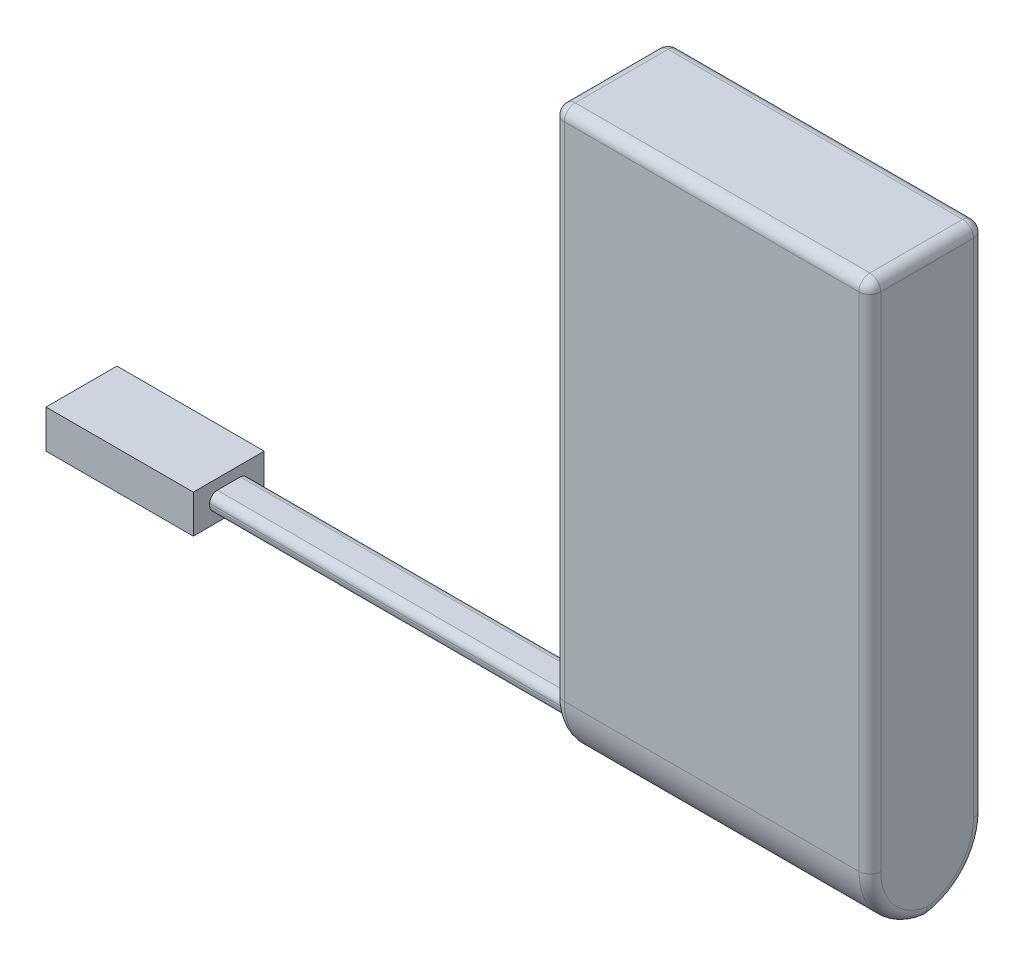
ISO-10303-21;
HEADER;
FILE_DESCRIPTION(('STEP AP214'),'2;1');
FILE_NAME('part.step','',(''),(''),'','','');
FILE_SCHEMA(('AUTOMOTIVE_DESIGN { 1 0 10303 214 1 1 1 1 }'));
ENDSEC;
DATA;
#1=APPLICATION_CONTEXT('core data for automotive mechanical design processes');
#2=APPLICATION_PROTOCOL_DEFINITION('international standard','automotive_design',2000,#1);
#3=PRODUCT_CONTEXT('',#1,'mechanical');
#4=PRODUCT('Part','Part','',(#3));
#5=PRODUCT_RELATED_PRODUCT_CATEGORY('part','',(#4));
#6=PRODUCT_DEFINITION_FORMATION('','',#4);
#7=PRODUCT_DEFINITION_CONTEXT('part definition',#1,'design');
#8=PRODUCT_DEFINITION('design','',#6,#7);
#9=PRODUCT_DEFINITION_SHAPE('','',#8);
#10=(LENGTH_UNIT() NAMED_UNIT(*) SI_UNIT(.MILLI.,.METRE.));
#11=(NAMED_UNIT(*) PLANE_ANGLE_UNIT() SI_UNIT($,.RADIAN.));
#12=(NAMED_UNIT(*) SI_UNIT($,.STERADIAN.) SOLID_ANGLE_UNIT());
#13=UNCERTAINTY_MEASURE_WITH_UNIT(LENGTH_MEASURE(1.E-05),#10,'distance_accuracy_value','');
#14=(GEOMETRIC_REPRESENTATION_CONTEXT(3) GLOBAL_UNCERTAINTY_ASSIGNED_CONTEXT((#13)) GLOBAL_UNIT_ASSIGNED_CONTEXT((#10,
#11,#12)) REPRESENTATION_CONTEXT('',''));
#15=CARTESIAN_POINT('',(0.,0.,0.));
#16=DIRECTION('',(0.,0.,1.));
#17=DIRECTION('',(1.,0.,0.));
#18=AXIS2_PLACEMENT_3D('',#15,#16,#17);
#19=CARTESIAN_POINT('',(-14.5,-26.5,10.5));
#20=DIRECTION('',(1.,0.,0.));
#21=DIRECTION('',(0.,0.,-1.));
#22=AXIS2_PLACEMENT_3D('',#19,#20,#21);
#23=PLANE('',#22);
#24=CARTESIAN_POINT('',(-14.5,-24.7434299833213,4.2));
#25=DIRECTION('',(-1.,0.,0.));
#26=DIRECTION('',(0.,0.,1.));
#27=AXIS2_PLACEMENT_3D('',#24,#25,#26);
#28=CIRCLE('',#27,0.699999999999999);
#29=CARTESIAN_POINT('',(-14.5,-24.7434299833213,3.5));
#30=VERTEX_POINT('',#29);
#31=CARTESIAN_POINT('',(-14.5,-24.8334798520684,3.50581629150589));
#32=VERTEX_POINT('',#31);
#33=EDGE_CURVE('E248',#30,#32,#28,.T.);
#34=ORIENTED_EDGE('',*,*,#33,.F.);
#35=DIRECTION('',(0.,-1.,0.));
#36=VECTOR('',#35,1.);
#37=CARTESIAN_POINT('',(-14.5,-24.5434299833213,3.5));
#38=LINE('',#37,#36);
#39=CARTESIAN_POINT('',(-14.5,-24.5434299833213,3.5));
#40=VERTEX_POINT('',#39);
#41=EDGE_CURVE('E258',#40,#30,#38,.T.);
#42=ORIENTED_EDGE('',*,*,#41,.F.);
#43=CARTESIAN_POINT('',(-14.5,-24.5434299833213,4.2));
#44=DIRECTION('',(-1.,0.,0.));
#45=DIRECTION('',(0.,0.,1.));
#46=AXIS2_PLACEMENT_3D('',#43,#44,#45);
#47=CIRCLE('',#46,0.699999999999999);
#48=CARTESIAN_POINT('',(-14.5,-23.8434299833213,4.2));
#49=VERTEX_POINT('',#48);
#50=EDGE_CURVE('E294',#49,#40,#47,.T.);
#51=ORIENTED_EDGE('',*,*,#50,.F.);
#52=DIRECTION('',(0.,0.,-1.));
#53=VECTOR('',#52,1.);
#54=CARTESIAN_POINT('',(-14.5,-23.8434299833213,6.29999999999999));
#55=LINE('',#54,#53);
#56=CARTESIAN_POINT('',(-14.5,-23.8434299833213,6.29999999999999));
#57=VERTEX_POINT('',#56);
#58=EDGE_CURVE('E291',#57,#49,#55,.T.);
#59=ORIENTED_EDGE('',*,*,#58,.F.);
#60=CARTESIAN_POINT('',(-14.5,-24.5434299833213,6.3));
#61=DIRECTION('',(-1.,0.,0.));
#62=DIRECTION('',(0.,0.,1.));
#63=AXIS2_PLACEMENT_3D('',#60,#61,#62);
#64=CIRCLE('',#63,0.7);
#65=CARTESIAN_POINT('',(-14.5,-24.5434299833213,7.));
#66=VERTEX_POINT('',#65);
#67=EDGE_CURVE('E76',#66,#57,#64,.T.);
#68=ORIENTED_EDGE('',*,*,#67,.F.);
#69=DIRECTION('',(0.,1.,0.));
#70=VECTOR('',#69,1.);
#71=CARTESIAN_POINT('',(-14.5,-24.5434299833213,7.));
#72=LINE('',#71,#70);
#73=CARTESIAN_POINT('',(-14.5,-24.7434299833213,7.));
#74=VERTEX_POINT('',#73);
#75=EDGE_CURVE('E71',#74,#66,#72,.T.);
#76=ORIENTED_EDGE('',*,*,#75,.F.);
#77=CARTESIAN_POINT('',(-14.5,-24.7434299833213,6.3));
#78=DIRECTION('',(-1.,0.,0.));
#79=DIRECTION('',(0.,0.,-1.));
#80=AXIS2_PLACEMENT_3D('',#77,#78,#79);
#81=CIRCLE('',#80,0.7);
#82=CARTESIAN_POINT('',(-14.5,-24.8334798520684,6.99418370849411));
#83=VERTEX_POINT('',#82);
#84=EDGE_CURVE('E285',#83,#74,#81,.T.);
#85=ORIENTED_EDGE('',*,*,#84,.F.);
#86=CARTESIAN_POINT('',(-14.5,-20.5,4.5));
#87=DIRECTION('',(1.,0.,0.));
#88=DIRECTION('',(0.,0.,-1.));
#89=AXIS2_PLACEMENT_3D('',#86,#87,#88);
#90=CIRCLE('',#89,5.);
#91=CARTESIAN_POINT('',(-14.5,-20.5,9.5));
#92=VERTEX_POINT('',#91);
#93=EDGE_CURVE('E338',#83,#92,#90,.F.);
#94=ORIENTED_EDGE('',*,*,#93,.T.);
#95=DIRECTION('',(0.,-1.,0.));
#96=VECTOR('',#95,1.);
#97=CARTESIAN_POINT('',(-14.5,26.5,9.5));
#98=LINE('',#97,#96);
#99=CARTESIAN_POINT('',(-14.5,25.5,9.5));
#100=VERTEX_POINT('',#99);
#101=EDGE_CURVE('E334',#92,#100,#98,.F.);
#102=ORIENTED_EDGE('',*,*,#101,.T.);
#103=DIRECTION('',(0.,0.,-1.));
#104=VECTOR('',#103,1.);
#105=CARTESIAN_POINT('',(-14.5,25.5,10.5));
#106=LINE('',#105,#104);
#107=CARTESIAN_POINT('',(-14.5,25.5,0.999999999999999));
#108=VERTEX_POINT('',#107);
#109=EDGE_CURVE('E330',#100,#108,#106,.T.);
#110=ORIENTED_EDGE('',*,*,#109,.T.);
#111=DIRECTION('',(0.,-1.,0.));
#112=VECTOR('',#111,1.);
#113=CARTESIAN_POINT('',(-14.5,-26.5,0.999999999999999));
#114=LINE('',#113,#112);
#115=CARTESIAN_POINT('',(-14.5,-20.5,0.999999999999999));
#116=VERTEX_POINT('',#115);
#117=EDGE_CURVE('E336',#108,#116,#114,.T.);
#118=ORIENTED_EDGE('',*,*,#117,.T.);
#119=CARTESIAN_POINT('',(-14.5,-20.5,6.));
#120=DIRECTION('',(1.,0.,0.));
#121=DIRECTION('',(0.,0.,-1.));
#122=AXIS2_PLACEMENT_3D('',#119,#120,#121);
#123=CIRCLE('',#122,5.);
#124=EDGE_CURVE('E343',#116,#32,#123,.F.);
#125=ORIENTED_EDGE('',*,*,#124,.T.);
#126=EDGE_LOOP('',(#34,#42,#51,#59,#68,#76,#85,#94,#102,#110,#118,#125));
#127=FACE_BOUND('',#126,.T.);
#128=ADVANCED_FACE('F49',(#127),#23,.F.);
#129=CARTESIAN_POINT('',(-14.5,26.5,10.5));
#130=DIRECTION('',(0.,-1.,0.));
#131=DIRECTION('',(1.,0.,0.));
#132=AXIS2_PLACEMENT_3D('',#129,#130,#131);
#133=PLANE('',#132);
#134=DIRECTION('',(-1.,0.,0.));
#135=VECTOR('',#134,1.);
#136=CARTESIAN_POINT('',(-14.5,26.5,0.999999999999999));
#137=LINE('',#136,#135);
#138=CARTESIAN_POINT('',(13.5,26.5,0.999999999999999));
#139=VERTEX_POINT('',#138);
#140=CARTESIAN_POINT('',(-13.5,26.5,0.999999999999999));
#141=VERTEX_POINT('',#140);
#142=EDGE_CURVE('E63',#139,#141,#137,.T.);
#143=ORIENTED_EDGE('',*,*,#142,.T.);
#144=DIRECTION('',(0.,0.,-1.));
#145=VECTOR('',#144,1.);
#146=CARTESIAN_POINT('',(-13.5,26.5,10.5));
#147=LINE('',#146,#145);
#148=CARTESIAN_POINT('',(-13.5,26.5,9.5));
#149=VERTEX_POINT('',#148);
#150=EDGE_CURVE('E11',#141,#149,#147,.F.);
#151=ORIENTED_EDGE('',*,*,#150,.T.);
#152=DIRECTION('',(-1.,0.,0.));
#153=VECTOR('',#152,1.);
#154=CARTESIAN_POINT('',(14.5,26.5,9.5));
#155=LINE('',#154,#153);
#156=CARTESIAN_POINT('',(13.5,26.5,9.5));
#157=VERTEX_POINT('',#156);
#158=EDGE_CURVE('E380',#149,#157,#155,.F.);
#159=ORIENTED_EDGE('',*,*,#158,.T.);
#160=DIRECTION('',(0.,0.,-1.));
#161=VECTOR('',#160,1.);
#162=CARTESIAN_POINT('',(13.5,26.5,10.5));
#163=LINE('',#162,#161);
#164=EDGE_CURVE('E378',#157,#139,#163,.T.);
#165=ORIENTED_EDGE('',*,*,#164,.T.);
#166=EDGE_LOOP('',(#143,#151,#159,#165));
#167=FACE_BOUND('',#166,.T.);
#168=ADVANCED_FACE('F463',(#167),#133,.F.);
#169=CARTESIAN_POINT('',(14.5,-26.5,10.5));
#170=DIRECTION('',(-1.,0.,0.));
#171=DIRECTION('',(0.,0.,1.));
#172=AXIS2_PLACEMENT_3D('',#169,#170,#171);
#173=PLANE('',#172);
#174=CARTESIAN_POINT('',(14.5,-20.5,6.));
#175=DIRECTION('',(-1.,0.,0.));
#176=DIRECTION('',(0.,0.,1.));
#177=AXIS2_PLACEMENT_3D('',#174,#175,#176);
#178=CIRCLE('',#177,5.);
#179=CARTESIAN_POINT('',(14.5,-25.4434299833213,5.25000000000001));
#180=VERTEX_POINT('',#179);
#181=CARTESIAN_POINT('',(14.5,-20.5,1.));
#182=VERTEX_POINT('',#181);
#183=EDGE_CURVE('E361',#180,#182,#178,.F.);
#184=ORIENTED_EDGE('',*,*,#183,.T.);
#185=DIRECTION('',(0.,1.,0.));
#186=VECTOR('',#185,1.);
#187=CARTESIAN_POINT('',(14.5,-26.5,0.999999999999999));
#188=LINE('',#187,#186);
#189=CARTESIAN_POINT('',(14.5,25.5,0.999999999999999));
#190=VERTEX_POINT('',#189);
#191=EDGE_CURVE('E364',#182,#190,#188,.T.);
#192=ORIENTED_EDGE('',*,*,#191,.T.);
#193=DIRECTION('',(0.,0.,-1.));
#194=VECTOR('',#193,1.);
#195=CARTESIAN_POINT('',(14.5,25.5,10.5));
#196=LINE('',#195,#194);
#197=CARTESIAN_POINT('',(14.5,25.5,9.5));
#198=VERTEX_POINT('',#197);
#199=EDGE_CURVE('E357',#190,#198,#196,.F.);
#200=ORIENTED_EDGE('',*,*,#199,.T.);
#201=DIRECTION('',(0.,1.,0.));
#202=VECTOR('',#201,1.);
#203=CARTESIAN_POINT('',(14.5,-20.5,9.5));
#204=LINE('',#203,#202);
#205=CARTESIAN_POINT('',(14.5,-20.5,9.5));
#206=VERTEX_POINT('',#205);
#207=EDGE_CURVE('E355',#198,#206,#204,.F.);
#208=ORIENTED_EDGE('',*,*,#207,.T.);
#209=CARTESIAN_POINT('',(14.5,-20.5,4.5));
#210=DIRECTION('',(-1.,0.,0.));
#211=DIRECTION('',(0.,0.,1.));
#212=AXIS2_PLACEMENT_3D('',#209,#210,#211);
#213=CIRCLE('',#212,5.);
#214=EDGE_CURVE('E359',#206,#180,#213,.F.);
#215=ORIENTED_EDGE('',*,*,#214,.T.);
#216=EDGE_LOOP('',(#184,#192,#200,#208,#215));
#217=FACE_BOUND('',#216,.T.);
#218=ADVANCED_FACE('F469',(#217),#173,.F.);
#219=CARTESIAN_POINT('',(0.,0.,10.5));
#220=DIRECTION('',(0.,0.,1.));
#221=DIRECTION('',(1.,0.,0.));
#222=AXIS2_PLACEMENT_3D('',#219,#220,#221);
#223=PLANE('',#222);
#224=DIRECTION('',(-1.,0.,0.));
#225=VECTOR('',#224,1.);
#226=CARTESIAN_POINT('',(-14.5,25.5,10.5));
#227=LINE('',#226,#225);
#228=CARTESIAN_POINT('',(13.5,25.5,10.5));
#229=VERTEX_POINT('',#228);
#230=CARTESIAN_POINT('',(-13.5,25.5,10.5));
#231=VERTEX_POINT('',#230);
#232=EDGE_CURVE('E374',#229,#231,#227,.T.);
#233=ORIENTED_EDGE('',*,*,#232,.T.);
#234=DIRECTION('',(0.,-1.,0.));
#235=VECTOR('',#234,1.);
#236=CARTESIAN_POINT('',(-13.5,-20.5,10.5));
#237=LINE('',#236,#235);
#238=CARTESIAN_POINT('',(-13.5,-20.5,10.5));
#239=VERTEX_POINT('',#238);
#240=EDGE_CURVE('E376',#231,#239,#237,.T.);
#241=ORIENTED_EDGE('',*,*,#240,.T.);
#242=DIRECTION('',(1.,0.,0.));
#243=VECTOR('',#242,1.);
#244=CARTESIAN_POINT('',(14.5,-20.5,10.5));
#245=LINE('',#244,#243);
#246=CARTESIAN_POINT('',(13.5,-20.5,10.5));
#247=VERTEX_POINT('',#246);
#248=EDGE_CURVE('E326',#239,#247,#245,.T.);
#249=ORIENTED_EDGE('',*,*,#248,.T.);
#250=DIRECTION('',(0.,1.,0.));
#251=VECTOR('',#250,1.);
#252=CARTESIAN_POINT('',(13.5,26.5,10.5));
#253=LINE('',#252,#251);
#254=EDGE_CURVE('E372',#247,#229,#253,.T.);
#255=ORIENTED_EDGE('',*,*,#254,.T.);
#256=EDGE_LOOP('',(#233,#241,#249,#255));
#257=FACE_BOUND('',#256,.T.);
#258=ADVANCED_FACE('F481',(#257),#223,.T.);
#259=CARTESIAN_POINT('',(0.,0.,0.));
#260=DIRECTION('',(0.,0.,1.));
#261=DIRECTION('',(1.,0.,0.));
#262=AXIS2_PLACEMENT_3D('',#259,#260,#261);
#263=PLANE('',#262);
#264=DIRECTION('',(1.,0.,0.));
#265=VECTOR('',#264,1.);
#266=CARTESIAN_POINT('',(0.,-20.5,0.));
#267=LINE('',#266,#265);
#268=CARTESIAN_POINT('',(13.5,-20.5,0.));
#269=VERTEX_POINT('',#268);
#270=CARTESIAN_POINT('',(-13.5,-20.5,0.));
#271=VERTEX_POINT('',#270);
#272=EDGE_CURVE('E323',#269,#271,#267,.F.);
#273=ORIENTED_EDGE('',*,*,#272,.T.);
#274=DIRECTION('',(0.,-1.,0.));
#275=VECTOR('',#274,1.);
#276=CARTESIAN_POINT('',(-13.5,0.,0.));
#277=LINE('',#276,#275);
#278=CARTESIAN_POINT('',(-13.5,25.5,0.));
#279=VERTEX_POINT('',#278);
#280=EDGE_CURVE('E370',#271,#279,#277,.F.);
#281=ORIENTED_EDGE('',*,*,#280,.T.);
#282=DIRECTION('',(-1.,0.,0.));
#283=VECTOR('',#282,1.);
#284=CARTESIAN_POINT('',(0.,25.5,0.));
#285=LINE('',#284,#283);
#286=CARTESIAN_POINT('',(13.5,25.5,0.));
#287=VERTEX_POINT('',#286);
#288=EDGE_CURVE('E368',#279,#287,#285,.F.);
#289=ORIENTED_EDGE('',*,*,#288,.T.);
#290=DIRECTION('',(0.,1.,0.));
#291=VECTOR('',#290,1.);
#292=CARTESIAN_POINT('',(13.5,0.,0.));
#293=LINE('',#292,#291);
#294=EDGE_CURVE('E366',#287,#269,#293,.F.);
#295=ORIENTED_EDGE('',*,*,#294,.T.);
#296=EDGE_LOOP('',(#273,#281,#289,#295));
#297=FACE_BOUND('',#296,.T.);
#298=ADVANCED_FACE('F475',(#297),#263,.F.);
#299=CARTESIAN_POINT('',(0.,-20.5,4.5));
#300=DIRECTION('',(-1.,0.,0.));
#301=DIRECTION('',(0.,-1.,0.));
#302=AXIS2_PLACEMENT_3D('',#299,#300,#301);
#303=CYLINDRICAL_SURFACE('',#302,6.);
#304=ORIENTED_EDGE('',*,*,#248,.F.);
#305=CARTESIAN_POINT('',(-13.5,-20.5,4.5));
#306=DIRECTION('',(1.,0.,0.));
#307=DIRECTION('',(0.,0.,-1.));
#308=AXIS2_PLACEMENT_3D('',#305,#306,#307);
#309=CIRCLE('',#308,6.);
#310=CARTESIAN_POINT('',(-13.5,-26.4529404498953,5.25000000000001));
#311=VERTEX_POINT('',#310);
#312=EDGE_CURVE('E353',#239,#311,#309,.T.);
#313=ORIENTED_EDGE('',*,*,#312,.T.);
#314=DIRECTION('',(-1.,0.,0.));
#315=VECTOR('',#314,1.);
#316=CARTESIAN_POINT('',(0.,-26.4529404498953,5.25000000000001));
#317=LINE('',#316,#315);
#318=CARTESIAN_POINT('',(13.5,-26.4529404498953,5.25000000000001));
#319=VERTEX_POINT('',#318);
#320=EDGE_CURVE('E327',#319,#311,#317,.T.);
#321=ORIENTED_EDGE('',*,*,#320,.F.);
#322=CARTESIAN_POINT('',(13.5,-20.5,4.5));
#323=DIRECTION('',(-1.,0.,0.));
#324=DIRECTION('',(0.,0.,1.));
#325=AXIS2_PLACEMENT_3D('',#322,#323,#324);
#326=CIRCLE('',#325,6.);
#327=EDGE_CURVE('E351',#319,#247,#326,.T.);
#328=ORIENTED_EDGE('',*,*,#327,.T.);
#329=EDGE_LOOP('',(#304,#313,#321,#328));
#330=FACE_BOUND('',#329,.T.);
#331=ADVANCED_FACE('F458',(#330),#303,.T.);
#332=CARTESIAN_POINT('',(-14.5,-20.5,6.));
#333=DIRECTION('',(1.,0.,0.));
#334=DIRECTION('',(0.,1.,0.));
#335=AXIS2_PLACEMENT_3D('',#332,#333,#334);
#336=CYLINDRICAL_SURFACE('',#335,6.);
#337=ORIENTED_EDGE('',*,*,#320,.T.);
#338=CARTESIAN_POINT('',(-13.5,-20.5,6.));
#339=DIRECTION('',(1.,0.,0.));
#340=DIRECTION('',(0.,0.,-1.));
#341=AXIS2_PLACEMENT_3D('',#338,#339,#340);
#342=CIRCLE('',#341,6.);
#343=EDGE_CURVE('E348',#311,#271,#342,.T.);
#344=ORIENTED_EDGE('',*,*,#343,.T.);
#345=ORIENTED_EDGE('',*,*,#272,.F.);
#346=CARTESIAN_POINT('',(13.5,-20.5,6.));
#347=DIRECTION('',(-1.,0.,0.));
#348=DIRECTION('',(0.,0.,1.));
#349=AXIS2_PLACEMENT_3D('',#346,#347,#348);
#350=CIRCLE('',#349,6.);
#351=EDGE_CURVE('E346',#269,#319,#350,.T.);
#352=ORIENTED_EDGE('',*,*,#351,.T.);
#353=EDGE_LOOP('',(#337,#344,#345,#352));
#354=FACE_BOUND('',#353,.T.);
#355=ADVANCED_FACE('F451',(#354),#336,.T.);
#356=CARTESIAN_POINT('',(13.5,-20.5,4.5));
#357=DIRECTION('',(-1.,0.,0.));
#358=DIRECTION('',(0.,0.,1.));
#359=AXIS2_PLACEMENT_3D('',#356,#357,#358);
#360=TOROIDAL_SURFACE('',#359,5.,1.);
#361=CARTESIAN_POINT('',(13.5,-20.5,9.5));
#362=DIRECTION('',(0.,1.,0.));
#363=DIRECTION('',(0.,0.,1.));
#364=AXIS2_PLACEMENT_3D('',#361,#362,#363);
#365=CIRCLE('',#364,1.);
#366=EDGE_CURVE('E563',#247,#206,#365,.T.);
#367=ORIENTED_EDGE('',*,*,#366,.F.);
#368=ORIENTED_EDGE('',*,*,#327,.F.);
#369=CARTESIAN_POINT('',(13.5,-26.4529404498953,5.25000000000001));
#370=CARTESIAN_POINT('',(13.5279652954629,-26.4529403595006,5.25000000000002));
#371=CARTESIAN_POINT('',(13.5559171454263,-26.4517573387929,5.25000000000002));
#372=CARTESIAN_POINT('',(13.6116197822076,-26.4470384488804,5.25000000000001));
#373=CARTESIAN_POINT('',(13.639370581212,-26.4435027235088,5.25000000000001));
#374=CARTESIAN_POINT('',(13.7219671792703,-26.4294025413347,5.25000000000001));
#375=CARTESIAN_POINT('',(13.7762579620223,-26.4153449711983,5.25000000000001));
#376=CARTESIAN_POINT('',(13.8817041796707,-26.3783205521778,5.25000000000001));
#377=CARTESIAN_POINT('',(13.9328583173883,-26.3553500456897,5.25000000000001));
#378=CARTESIAN_POINT('',(14.0305976267367,-26.3011753810624,5.25000000000001));
#379=CARTESIAN_POINT('',(14.0771836158628,-26.2699726998179,5.25000000000001));
#380=CARTESIAN_POINT('',(14.1646292057768,-26.2001314549026,5.25000000000001));
#381=CARTESIAN_POINT('',(14.2054710130505,-26.1614706290598,5.25000000000001));
#382=CARTESIAN_POINT('',(14.2801557444523,-26.0778734095032,5.25));
#383=CARTESIAN_POINT('',(14.3139963911404,-26.0329349816576,5.24999999999999));
#384=CARTESIAN_POINT('',(14.3739871815263,-25.9377057284558,5.25000000000002));
#385=CARTESIAN_POINT('',(14.4000754882913,-25.8873760061334,5.25000000000005));
#386=CARTESIAN_POINT('',(14.4435020080802,-25.7830936933561,5.24999999999994));
#387=CARTESIAN_POINT('',(14.4608461463213,-25.7291435843095,5.24999999999979));
#388=CARTESIAN_POINT('',(14.4819438335437,-25.6382334201923,5.25000000000011));
#389=CARTESIAN_POINT('',(14.4883236614474,-25.6018574255828,5.25000000000038));
#390=CARTESIAN_POINT('',(14.497106366199,-25.5286663652138,5.24999999999954));
#391=CARTESIAN_POINT('',(14.4995157180242,-25.4918521131267,5.24999999999842));
#392=CARTESIAN_POINT('',(14.4999780800099,-25.4511717538409,5.24999999999969));
#393=CARTESIAN_POINT('',(14.500000057568,-25.4473006933808,5.24999999999984));
#394=CARTESIAN_POINT('',(14.5,-25.4434299833213,5.25000000000001));
#395=B_SPLINE_CURVE_WITH_KNOTS('',3,(#369,#370,#371,#372,#373,#374,#375,#376,#377,#378,#379,
#380,#381,#382,#383,#384,#385,#386,#387,#388,#389,#390,#391,#392,#393,#394),.UNSPECIFIED.,.F.,
.F.,(4,2,2,2,2,2,2,2,2,2,2,2,4),(0.,0.08384419102722,0.167683256688507,0.335062900529813,
0.502511304770882,0.669929688307922,0.83785576347359,1.00583637849734,1.17512299340878,
1.34429474174609,1.45490041839898,1.5653255422625,1.57693861572171),.UNSPECIFIED.);
#396=EDGE_CURVE('E54',#180,#319,#395,.F.);
#397=ORIENTED_EDGE('',*,*,#396,.F.);
#398=ORIENTED_EDGE('',*,*,#214,.F.);
#399=EDGE_LOOP('',(#367,#368,#397,#398));
#400=FACE_BOUND('',#399,.T.);
#401=ADVANCED_FACE('F448',(#400),#360,.T.);
#402=CARTESIAN_POINT('',(13.5,-20.5,6.));
#403=DIRECTION('',(-1.,0.,0.));
#404=DIRECTION('',(0.,0.,1.));
#405=AXIS2_PLACEMENT_3D('',#402,#403,#404);
#406=TOROIDAL_SURFACE('',#405,5.,1.);
#407=ORIENTED_EDGE('',*,*,#396,.T.);
#408=ORIENTED_EDGE('',*,*,#351,.F.);
#409=CARTESIAN_POINT('',(13.5,-20.5,1.));
#410=DIRECTION('',(0.,1.,0.));
#411=DIRECTION('',(0.,0.,1.));
#412=AXIS2_PLACEMENT_3D('',#409,#410,#411);
#413=CIRCLE('',#412,1.);
#414=EDGE_CURVE('E536',#182,#269,#413,.T.);
#415=ORIENTED_EDGE('',*,*,#414,.F.);
#416=ORIENTED_EDGE('',*,*,#183,.F.);
#417=EDGE_LOOP('',(#407,#408,#415,#416));
#418=FACE_BOUND('',#417,.T.);
#419=ADVANCED_FACE('F51',(#418),#406,.T.);
#420=CARTESIAN_POINT('',(13.5,0.,9.5));
#421=DIRECTION('',(0.,-1.,0.));
#422=DIRECTION('',(0.,0.,-1.));
#423=AXIS2_PLACEMENT_3D('',#420,#421,#422);
#424=CYLINDRICAL_SURFACE('',#423,1.);
#425=ORIENTED_EDGE('',*,*,#366,.T.);
#426=ORIENTED_EDGE('',*,*,#207,.F.);
#427=CARTESIAN_POINT('',(13.5,25.5,9.5));
#428=DIRECTION('',(0.,1.,0.));
#429=DIRECTION('',(0.,0.,1.));
#430=AXIS2_PLACEMENT_3D('',#427,#428,#429);
#431=CIRCLE('',#430,1.);
#432=EDGE_CURVE('E543',#229,#198,#431,.T.);
#433=ORIENTED_EDGE('',*,*,#432,.F.);
#434=ORIENTED_EDGE('',*,*,#254,.F.);
#435=EDGE_LOOP('',(#425,#426,#433,#434));
#436=FACE_BOUND('',#435,.T.);
#437=ADVANCED_FACE('F444',(#436),#424,.T.);
#438=CARTESIAN_POINT('',(13.5,-26.5,0.999999999999999));
#439=DIRECTION('',(0.,1.,0.));
#440=DIRECTION('',(0.,0.,1.));
#441=AXIS2_PLACEMENT_3D('',#438,#439,#440);
#442=CYLINDRICAL_SURFACE('',#441,1.);
#443=ORIENTED_EDGE('',*,*,#414,.T.);
#444=ORIENTED_EDGE('',*,*,#294,.F.);
#445=CARTESIAN_POINT('',(13.5,25.5,0.999999999999999));
#446=DIRECTION('',(0.,1.,0.));
#447=DIRECTION('',(0.,0.,1.));
#448=AXIS2_PLACEMENT_3D('',#445,#446,#447);
#449=CIRCLE('',#448,1.);
#450=EDGE_CURVE('E533',#190,#287,#449,.T.);
#451=ORIENTED_EDGE('',*,*,#450,.F.);
#452=ORIENTED_EDGE('',*,*,#191,.F.);
#453=EDGE_LOOP('',(#443,#444,#451,#452));
#454=FACE_BOUND('',#453,.T.);
#455=ADVANCED_FACE('F440',(#454),#442,.T.);
#456=CARTESIAN_POINT('',(13.5,25.5,10.5));
#457=DIRECTION('',(0.,0.,-1.));
#458=DIRECTION('',(-1.,0.,0.));
#459=AXIS2_PLACEMENT_3D('',#456,#457,#458);
#460=CYLINDRICAL_SURFACE('',#459,1.);
#461=CARTESIAN_POINT('',(13.5,25.5,9.5));
#462=DIRECTION('',(0.,0.,1.));
#463=DIRECTION('',(1.,0.,0.));
#464=AXIS2_PLACEMENT_3D('',#461,#462,#463);
#465=CIRCLE('',#464,1.);
#466=EDGE_CURVE('E560',#198,#157,#465,.T.);
#467=ORIENTED_EDGE('',*,*,#466,.F.);
#468=ORIENTED_EDGE('',*,*,#199,.F.);
#469=CARTESIAN_POINT('',(13.5,25.5,0.999999999999999));
#470=DIRECTION('',(0.,0.,-1.));
#471=DIRECTION('',(-1.,0.,0.));
#472=AXIS2_PLACEMENT_3D('',#469,#470,#471);
#473=CIRCLE('',#472,1.);
#474=EDGE_CURVE('E542',#139,#190,#473,.T.);
#475=ORIENTED_EDGE('',*,*,#474,.F.);
#476=ORIENTED_EDGE('',*,*,#164,.F.);
#477=EDGE_LOOP('',(#467,#468,#475,#476));
#478=FACE_BOUND('',#477,.T.);
#479=ADVANCED_FACE('F436',(#478),#460,.T.);
#480=CARTESIAN_POINT('',(13.5,25.5,9.5));
#481=DIRECTION('',(1.,0.,0.));
#482=DIRECTION('',(0.,0.,-1.));
#483=AXIS2_PLACEMENT_3D('',#480,#481,#482);
#484=SPHERICAL_SURFACE('',#483,1.);
#485=ORIENTED_EDGE('',*,*,#432,.T.);
#486=ORIENTED_EDGE('',*,*,#466,.T.);
#487=CARTESIAN_POINT('',(13.5,25.5,9.5));
#488=DIRECTION('',(1.,0.,0.));
#489=DIRECTION('',(0.,0.,-1.));
#490=AXIS2_PLACEMENT_3D('',#487,#488,#489);
#491=CIRCLE('',#490,1.);
#492=EDGE_CURVE('E547',#229,#157,#491,.F.);
#493=ORIENTED_EDGE('',*,*,#492,.F.);
#494=EDGE_LOOP('',(#485,#486,#493));
#495=FACE_BOUND('',#494,.T.);
#496=ADVANCED_FACE('F432',(#495),#484,.T.);
#497=CARTESIAN_POINT('',(13.5,25.5,1.));
#498=DIRECTION('',(1.,0.,0.));
#499=DIRECTION('',(0.,0.,-1.));
#500=AXIS2_PLACEMENT_3D('',#497,#498,#499);
#501=SPHERICAL_SURFACE('',#500,1.);
#502=ORIENTED_EDGE('',*,*,#474,.T.);
#503=ORIENTED_EDGE('',*,*,#450,.T.);
#504=CARTESIAN_POINT('',(13.5,25.5,1.));
#505=DIRECTION('',(1.,0.,0.));
#506=DIRECTION('',(0.,1.,0.));
#507=AXIS2_PLACEMENT_3D('',#504,#505,#506);
#508=CIRCLE('',#507,1.);
#509=EDGE_CURVE('E539',#139,#287,#508,.F.);
#510=ORIENTED_EDGE('',*,*,#509,.F.);
#511=EDGE_LOOP('',(#502,#503,#510));
#512=FACE_BOUND('',#511,.T.);
#513=ADVANCED_FACE('F428',(#512),#501,.T.);
#514=CARTESIAN_POINT('',(0.,25.5,9.5));
#515=DIRECTION('',(1.,0.,0.));
#516=DIRECTION('',(0.,1.,0.));
#517=AXIS2_PLACEMENT_3D('',#514,#515,#516);
#518=CYLINDRICAL_SURFACE('',#517,1.);
#519=ORIENTED_EDGE('',*,*,#492,.T.);
#520=ORIENTED_EDGE('',*,*,#158,.F.);
#521=CARTESIAN_POINT('',(-13.5,25.5,9.5));
#522=DIRECTION('',(-1.,0.,0.));
#523=DIRECTION('',(0.,0.,1.));
#524=AXIS2_PLACEMENT_3D('',#521,#522,#523);
#525=CIRCLE('',#524,1.);
#526=EDGE_CURVE('E553',#231,#149,#525,.T.);
#527=ORIENTED_EDGE('',*,*,#526,.F.);
#528=ORIENTED_EDGE('',*,*,#232,.F.);
#529=EDGE_LOOP('',(#519,#520,#527,#528));
#530=FACE_BOUND('',#529,.T.);
#531=ADVANCED_FACE('F424',(#530),#518,.T.);
#532=CARTESIAN_POINT('',(-14.5,25.5,0.999999999999999));
#533=DIRECTION('',(-1.,0.,0.));
#534=DIRECTION('',(0.,-1.,0.));
#535=AXIS2_PLACEMENT_3D('',#532,#533,#534);
#536=CYLINDRICAL_SURFACE('',#535,1.);
#537=ORIENTED_EDGE('',*,*,#509,.T.);
#538=ORIENTED_EDGE('',*,*,#288,.F.);
#539=CARTESIAN_POINT('',(-13.5,25.5,0.999999999999999));
#540=DIRECTION('',(-1.,0.,0.));
#541=DIRECTION('',(0.,0.,1.));
#542=AXIS2_PLACEMENT_3D('',#539,#540,#541);
#543=CIRCLE('',#542,1.);
#544=EDGE_CURVE('E578',#141,#279,#543,.T.);
#545=ORIENTED_EDGE('',*,*,#544,.F.);
#546=ORIENTED_EDGE('',*,*,#142,.F.);
#547=EDGE_LOOP('',(#537,#538,#545,#546));
#548=FACE_BOUND('',#547,.T.);
#549=ADVANCED_FACE('F420',(#548),#536,.T.);
#550=CARTESIAN_POINT('',(-13.5,25.5,10.5));
#551=DIRECTION('',(0.,0.,-1.));
#552=DIRECTION('',(-1.,0.,0.));
#553=AXIS2_PLACEMENT_3D('',#550,#551,#552);
#554=CYLINDRICAL_SURFACE('',#553,1.);
#555=CARTESIAN_POINT('',(-13.5,25.5,9.5));
#556=DIRECTION('',(0.,0.,1.));
#557=DIRECTION('',(1.,0.,0.));
#558=AXIS2_PLACEMENT_3D('',#555,#556,#557);
#559=CIRCLE('',#558,1.);
#560=EDGE_CURVE('E548',#149,#100,#559,.T.);
#561=ORIENTED_EDGE('',*,*,#560,.F.);
#562=ORIENTED_EDGE('',*,*,#150,.F.);
#563=CARTESIAN_POINT('',(-13.5,25.5,0.999999999999999));
#564=DIRECTION('',(0.,0.,-1.));
#565=DIRECTION('',(-1.,0.,0.));
#566=AXIS2_PLACEMENT_3D('',#563,#564,#565);
#567=CIRCLE('',#566,1.);
#568=EDGE_CURVE('E580',#108,#141,#567,.T.);
#569=ORIENTED_EDGE('',*,*,#568,.F.);
#570=ORIENTED_EDGE('',*,*,#109,.F.);
#571=EDGE_LOOP('',(#561,#562,#569,#570));
#572=FACE_BOUND('',#571,.T.);
#573=ADVANCED_FACE('F416',(#572),#554,.T.);
#574=CARTESIAN_POINT('',(-13.5,25.5,9.5));
#575=DIRECTION('',(0.,1.,0.));
#576=DIRECTION('',(0.,0.,1.));
#577=AXIS2_PLACEMENT_3D('',#574,#575,#576);
#578=SPHERICAL_SURFACE('',#577,1.);
#579=ORIENTED_EDGE('',*,*,#526,.T.);
#580=ORIENTED_EDGE('',*,*,#560,.T.);
#581=CARTESIAN_POINT('',(-13.5,25.5,9.5));
#582=DIRECTION('',(0.,1.,0.));
#583=DIRECTION('',(0.,0.,1.));
#584=AXIS2_PLACEMENT_3D('',#581,#582,#583);
#585=CIRCLE('',#584,1.);
#586=EDGE_CURVE('E579',#231,#100,#585,.F.);
#587=ORIENTED_EDGE('',*,*,#586,.F.);
#588=EDGE_LOOP('',(#579,#580,#587));
#589=FACE_BOUND('',#588,.T.);
#590=ADVANCED_FACE('F412',(#589),#578,.T.);
#591=CARTESIAN_POINT('',(-13.5,25.5,1.));
#592=DIRECTION('',(0.,1.,0.));
#593=DIRECTION('',(0.,0.,1.));
#594=AXIS2_PLACEMENT_3D('',#591,#592,#593);
#595=SPHERICAL_SURFACE('',#594,1.);
#596=ORIENTED_EDGE('',*,*,#568,.T.);
#597=ORIENTED_EDGE('',*,*,#544,.T.);
#598=CARTESIAN_POINT('',(-13.5,25.5,1.));
#599=DIRECTION('',(0.,1.,0.));
#600=DIRECTION('',(0.,0.,1.));
#601=AXIS2_PLACEMENT_3D('',#598,#599,#600);
#602=CIRCLE('',#601,1.);
#603=EDGE_CURVE('E495',#108,#279,#602,.F.);
#604=ORIENTED_EDGE('',*,*,#603,.F.);
#605=EDGE_LOOP('',(#596,#597,#604));
#606=FACE_BOUND('',#605,.T.);
#607=ADVANCED_FACE('F408',(#606),#595,.T.);
#608=CARTESIAN_POINT('',(-13.5,0.,9.5));
#609=DIRECTION('',(0.,1.,0.));
#610=DIRECTION('',(0.,0.,1.));
#611=AXIS2_PLACEMENT_3D('',#608,#609,#610);
#612=CYLINDRICAL_SURFACE('',#611,1.);
#613=ORIENTED_EDGE('',*,*,#586,.T.);
#614=ORIENTED_EDGE('',*,*,#101,.F.);
#615=CARTESIAN_POINT('',(-13.5,-20.5,9.5));
#616=DIRECTION('',(0.,-1.,0.));
#617=DIRECTION('',(0.,0.,-1.));
#618=AXIS2_PLACEMENT_3D('',#615,#616,#617);
#619=CIRCLE('',#618,1.);
#620=EDGE_CURVE('E492',#239,#92,#619,.T.);
#621=ORIENTED_EDGE('',*,*,#620,.F.);
#622=ORIENTED_EDGE('',*,*,#240,.F.);
#623=EDGE_LOOP('',(#613,#614,#621,#622));
#624=FACE_BOUND('',#623,.T.);
#625=ADVANCED_FACE('F404',(#624),#612,.T.);
#626=CARTESIAN_POINT('',(-13.5,-26.5,0.999999999999999));
#627=DIRECTION('',(0.,-1.,0.));
#628=DIRECTION('',(0.,0.,-1.));
#629=AXIS2_PLACEMENT_3D('',#626,#627,#628);
#630=CYLINDRICAL_SURFACE('',#629,1.);
#631=ORIENTED_EDGE('',*,*,#603,.T.);
#632=ORIENTED_EDGE('',*,*,#280,.F.);
#633=CARTESIAN_POINT('',(-13.5,-20.5,0.999999999999999));
#634=DIRECTION('',(0.,-1.,0.));
#635=DIRECTION('',(0.,0.,-1.));
#636=AXIS2_PLACEMENT_3D('',#633,#634,#635);
#637=CIRCLE('',#636,1.);
#638=EDGE_CURVE('E391',#116,#271,#637,.T.);
#639=ORIENTED_EDGE('',*,*,#638,.F.);
#640=ORIENTED_EDGE('',*,*,#117,.F.);
#641=EDGE_LOOP('',(#631,#632,#639,#640));
#642=FACE_BOUND('',#641,.T.);
#643=ADVANCED_FACE('F400',(#642),#630,.T.);
#644=CARTESIAN_POINT('',(-13.5,-20.5,4.5));
#645=DIRECTION('',(1.,0.,0.));
#646=DIRECTION('',(0.,0.,-1.));
#647=AXIS2_PLACEMENT_3D('',#644,#645,#646);
#648=TOROIDAL_SURFACE('',#647,5.,1.);
#649=ORIENTED_EDGE('',*,*,#620,.T.);
#650=ORIENTED_EDGE('',*,*,#93,.F.);
#651=CARTESIAN_POINT('',(-14.5,-25.4434299833213,5.25));
#652=VERTEX_POINT('',#651);
#653=EDGE_CURVE('E339',#652,#83,#90,.F.);
#654=ORIENTED_EDGE('',*,*,#653,.F.);
#655=CARTESIAN_POINT('',(-13.5,-26.4529404498953,5.25000000000001));
#656=CARTESIAN_POINT('',(-13.5279652954629,-26.4529403595006,5.25000000000001));
#657=CARTESIAN_POINT('',(-13.5559171454263,-26.4517573387929,5.25));
#658=CARTESIAN_POINT('',(-13.6116197822076,-26.4470384488804,5.25));
#659=CARTESIAN_POINT('',(-13.639370581212,-26.4435027235088,5.25));
#660=CARTESIAN_POINT('',(-13.7219671792703,-26.4294025413347,5.24999999999999));
#661=CARTESIAN_POINT('',(-13.7762579620223,-26.4153449711983,5.25));
#662=CARTESIAN_POINT('',(-13.8817041796707,-26.3783205521778,5.25));
#663=CARTESIAN_POINT('',(-13.9328583173883,-26.3553500456897,5.25));
#664=CARTESIAN_POINT('',(-14.0305976267367,-26.3011753810624,5.25));
#665=CARTESIAN_POINT('',(-14.0771836158628,-26.2699726998179,5.25));
#666=CARTESIAN_POINT('',(-14.1646292057768,-26.2001314549026,5.25));
#667=CARTESIAN_POINT('',(-14.2054710130505,-26.1614706290598,5.25));
#668=CARTESIAN_POINT('',(-14.2801557444523,-26.0778734095032,5.25));
#669=CARTESIAN_POINT('',(-14.3139963911404,-26.0329349816576,5.25));
#670=CARTESIAN_POINT('',(-14.3739871815263,-25.9377057284558,5.25));
#671=CARTESIAN_POINT('',(-14.4000754882912,-25.8873760061334,5.25));
#672=CARTESIAN_POINT('',(-14.4435020080802,-25.7830936933561,5.25));
#673=CARTESIAN_POINT('',(-14.4608461463213,-25.7291435843095,5.25));
#674=CARTESIAN_POINT('',(-14.4819438335437,-25.6382334201923,5.25));
#675=CARTESIAN_POINT('',(-14.4883236614474,-25.6018574255829,5.25));
#676=CARTESIAN_POINT('',(-14.497106366199,-25.5286663652138,5.25));
#677=CARTESIAN_POINT('',(-14.4995157180242,-25.4918521131267,5.25));
#678=CARTESIAN_POINT('',(-14.4999780800099,-25.4511717538409,5.25));
#679=CARTESIAN_POINT('',(-14.500000057568,-25.4473006933808,5.25));
#680=CARTESIAN_POINT('',(-14.5,-25.4434299833213,5.25));
#681=B_SPLINE_CURVE_WITH_KNOTS('',3,(#655,#656,#657,#658,#659,#660,#661,#662,#663,#664,#665,
#666,#667,#668,#669,#670,#671,#672,#673,#674,#675,#676,#677,#678,#679,#680),.UNSPECIFIED.,.F.,
.F.,(4,2,2,2,2,2,2,2,2,2,2,2,4),(0.,0.0838441910272217,0.167683256688505,0.335062900529813,
0.502511304770878,0.669929688307919,0.837855763473587,1.00583637849734,1.17512299340878,
1.34429474174609,1.45490041839898,1.56532554226249,1.5769386157217),.UNSPECIFIED.);
#682=EDGE_CURVE('E322',#311,#652,#681,.T.);
#683=ORIENTED_EDGE('',*,*,#682,.F.);
#684=ORIENTED_EDGE('',*,*,#312,.F.);
#685=EDGE_LOOP('',(#649,#650,#654,#683,#684));
#686=FACE_BOUND('',#685,.T.);
#687=ADVANCED_FACE('F396',(#686),#648,.T.);
#688=CARTESIAN_POINT('',(-13.5,-20.5,6.));
#689=DIRECTION('',(1.,0.,0.));
#690=DIRECTION('',(0.,0.,-1.));
#691=AXIS2_PLACEMENT_3D('',#688,#689,#690);
#692=TOROIDAL_SURFACE('',#691,5.,1.);
#693=ORIENTED_EDGE('',*,*,#638,.T.);
#694=ORIENTED_EDGE('',*,*,#343,.F.);
#695=ORIENTED_EDGE('',*,*,#682,.T.);
#696=EDGE_CURVE('E342',#32,#652,#123,.F.);
#697=ORIENTED_EDGE('',*,*,#696,.F.);
#698=ORIENTED_EDGE('',*,*,#124,.F.);
#699=EDGE_LOOP('',(#693,#694,#695,#697,#698));
#700=FACE_BOUND('',#699,.T.);
#701=ADVANCED_FACE('F393',(#700),#692,.T.);
#702=CARTESIAN_POINT('',(-14.5,-24.7434299833213,4.2));
#703=DIRECTION('',(-1.,0.,0.));
#704=DIRECTION('',(0.,0.,1.));
#705=AXIS2_PLACEMENT_3D('',#702,#703,#704);
#706=PLANE('',#705);
#707=DIRECTION('',(0.,0.,1.));
#708=VECTOR('',#707,1.);
#709=CARTESIAN_POINT('',(-14.5,-25.4434299833213,6.29999999999999));
#710=LINE('',#709,#708);
#711=CARTESIAN_POINT('',(-14.5,-25.4434299833213,6.29999999999999));
#712=VERTEX_POINT('',#711);
#713=EDGE_CURVE('E281',#652,#712,#710,.T.);
#714=ORIENTED_EDGE('',*,*,#713,.F.);
#715=ORIENTED_EDGE('',*,*,#653,.T.);
#716=EDGE_CURVE('E286',#712,#83,#81,.T.);
#717=ORIENTED_EDGE('',*,*,#716,.F.);
#718=EDGE_LOOP('',(#714,#715,#717));
#719=FACE_BOUND('',#718,.T.);
#720=ADVANCED_FACE('F508',(#719),#706,.F.);
#721=CARTESIAN_POINT('',(-49.5,-24.7434299833213,4.2));
#722=DIRECTION('',(1.,0.,0.));
#723=DIRECTION('',(0.,0.,-1.));
#724=AXIS2_PLACEMENT_3D('',#721,#722,#723);
#725=CYLINDRICAL_SURFACE('',#724,0.699999999999999);
#726=ORIENTED_EDGE('',*,*,#33,.T.);
#727=CARTESIAN_POINT('',(-14.5,-25.4434299833213,4.2));
#728=VERTEX_POINT('',#727);
#729=EDGE_CURVE('E246',#32,#728,#28,.T.);
#730=ORIENTED_EDGE('',*,*,#729,.T.);
#731=DIRECTION('',(1.,0.,0.));
#732=VECTOR('',#731,1.);
#733=CARTESIAN_POINT('',(-49.5,-25.4434299833213,4.2));
#734=LINE('',#733,#732);
#735=CARTESIAN_POINT('',(-49.5,-25.4434299833213,4.2));
#736=VERTEX_POINT('',#735);
#737=EDGE_CURVE('E319',#736,#728,#734,.T.);
#738=ORIENTED_EDGE('',*,*,#737,.F.);
#739=CARTESIAN_POINT('',(-49.5,-24.7434299833213,4.2));
#740=DIRECTION('',(-1.,0.,0.));
#741=DIRECTION('',(0.,0.,1.));
#742=AXIS2_PLACEMENT_3D('',#739,#740,#741);
#743=CIRCLE('',#742,0.699999999999999);
#744=CARTESIAN_POINT('',(-49.5,-24.7434299833213,3.5));
#745=VERTEX_POINT('',#744);
#746=EDGE_CURVE('E254',#745,#736,#743,.T.);
#747=ORIENTED_EDGE('',*,*,#746,.F.);
#748=DIRECTION('',(1.,0.,0.));
#749=VECTOR('',#748,1.);
#750=CARTESIAN_POINT('',(-49.5,-24.7434299833213,3.5));
#751=LINE('',#750,#749);
#752=EDGE_CURVE('E278',#745,#30,#751,.T.);
#753=ORIENTED_EDGE('',*,*,#752,.T.);
#754=EDGE_LOOP('',(#726,#730,#738,#747,#753));
#755=FACE_BOUND('',#754,.T.);
#756=ADVANCED_FACE('F513',(#755),#725,.T.);
#757=CARTESIAN_POINT('',(-49.5,-25.4434299833213,6.29999999999999));
#758=DIRECTION('',(0.,1.,0.));
#759=DIRECTION('',(0.,0.,1.));
#760=AXIS2_PLACEMENT_3D('',#757,#758,#759);
#761=PLANE('',#760);
#762=EDGE_CURVE('E282',#728,#652,#710,.T.);
#763=ORIENTED_EDGE('',*,*,#762,.T.);
#764=ORIENTED_EDGE('',*,*,#713,.T.);
#765=DIRECTION('',(1.,0.,0.));
#766=VECTOR('',#765,1.);
#767=CARTESIAN_POINT('',(-49.5,-25.4434299833213,6.29999999999999));
#768=LINE('',#767,#766);
#769=CARTESIAN_POINT('',(-49.5,-25.4434299833213,6.29999999999999));
#770=VERTEX_POINT('',#769);
#771=EDGE_CURVE('E316',#770,#712,#768,.T.);
#772=ORIENTED_EDGE('',*,*,#771,.F.);
#773=DIRECTION('',(0.,0.,1.));
#774=VECTOR('',#773,1.);
#775=CARTESIAN_POINT('',(-49.5,-25.4434299833213,6.29999999999999));
#776=LINE('',#775,#774);
#777=EDGE_CURVE('E257',#736,#770,#776,.T.);
#778=ORIENTED_EDGE('',*,*,#777,.F.);
#779=ORIENTED_EDGE('',*,*,#737,.T.);
#780=EDGE_LOOP('',(#763,#764,#772,#778,#779));
#781=FACE_BOUND('',#780,.T.);
#782=ADVANCED_FACE('F510',(#781),#761,.F.);
#783=CARTESIAN_POINT('',(-49.5,-24.7434299833213,6.3));
#784=DIRECTION('',(1.,0.,0.));
#785=DIRECTION('',(0.,0.,-1.));
#786=AXIS2_PLACEMENT_3D('',#783,#784,#785);
#787=CYLINDRICAL_SURFACE('',#786,0.7);
#788=ORIENTED_EDGE('',*,*,#716,.T.);
#789=ORIENTED_EDGE('',*,*,#84,.T.);
#790=DIRECTION('',(1.,0.,0.));
#791=VECTOR('',#790,1.);
#792=CARTESIAN_POINT('',(-49.5,-24.7434299833213,7.));
#793=LINE('',#792,#791);
#794=CARTESIAN_POINT('',(-49.5,-24.7434299833213,7.));
#795=VERTEX_POINT('',#794);
#796=EDGE_CURVE('E313',#795,#74,#793,.T.);
#797=ORIENTED_EDGE('',*,*,#796,.F.);
#798=CARTESIAN_POINT('',(-49.5,-24.7434299833213,6.3));
#799=DIRECTION('',(-1.,0.,0.));
#800=DIRECTION('',(0.,0.,-1.));
#801=AXIS2_PLACEMENT_3D('',#798,#799,#800);
#802=CIRCLE('',#801,0.7);
#803=EDGE_CURVE('E261',#770,#795,#802,.T.);
#804=ORIENTED_EDGE('',*,*,#803,.F.);
#805=ORIENTED_EDGE('',*,*,#771,.T.);
#806=EDGE_LOOP('',(#788,#789,#797,#804,#805));
#807=FACE_BOUND('',#806,.T.);
#808=ADVANCED_FACE('F604',(#807),#787,.T.);
#809=CARTESIAN_POINT('',(-49.5,-24.5434299833213,7.));
#810=DIRECTION('',(0.,0.,-1.));
#811=DIRECTION('',(-1.,0.,0.));
#812=AXIS2_PLACEMENT_3D('',#809,#810,#811);
#813=PLANE('',#812);
#814=ORIENTED_EDGE('',*,*,#75,.T.);
#815=DIRECTION('',(1.,0.,0.));
#816=VECTOR('',#815,1.);
#817=CARTESIAN_POINT('',(-49.5,-24.5434299833213,7.));
#818=LINE('',#817,#816);
#819=CARTESIAN_POINT('',(-49.5,-24.5434299833213,7.));
#820=VERTEX_POINT('',#819);
#821=EDGE_CURVE('E310',#820,#66,#818,.T.);
#822=ORIENTED_EDGE('',*,*,#821,.F.);
#823=DIRECTION('',(0.,1.,0.));
#824=VECTOR('',#823,1.);
#825=CARTESIAN_POINT('',(-49.5,-24.5434299833213,7.));
#826=LINE('',#825,#824);
#827=EDGE_CURVE('E264',#795,#820,#826,.T.);
#828=ORIENTED_EDGE('',*,*,#827,.F.);
#829=ORIENTED_EDGE('',*,*,#796,.T.);
#830=EDGE_LOOP('',(#814,#822,#828,#829));
#831=FACE_BOUND('',#830,.T.);
#832=ADVANCED_FACE('F607',(#831),#813,.F.);
#833=CARTESIAN_POINT('',(-49.5,-24.5434299833213,6.3));
#834=DIRECTION('',(1.,0.,0.));
#835=DIRECTION('',(0.,0.,-1.));
#836=AXIS2_PLACEMENT_3D('',#833,#834,#835);
#837=CYLINDRICAL_SURFACE('',#836,0.7);
#838=ORIENTED_EDGE('',*,*,#67,.T.);
#839=DIRECTION('',(1.,0.,0.));
#840=VECTOR('',#839,1.);
#841=CARTESIAN_POINT('',(-49.5,-23.8434299833213,6.29999999999999));
#842=LINE('',#841,#840);
#843=CARTESIAN_POINT('',(-49.5,-23.8434299833213,6.29999999999999));
#844=VERTEX_POINT('',#843);
#845=EDGE_CURVE('E307',#844,#57,#842,.T.);
#846=ORIENTED_EDGE('',*,*,#845,.F.);
#847=CARTESIAN_POINT('',(-49.5,-24.5434299833213,6.3));
#848=DIRECTION('',(-1.,0.,0.));
#849=DIRECTION('',(0.,0.,1.));
#850=AXIS2_PLACEMENT_3D('',#847,#848,#849);
#851=CIRCLE('',#850,0.7);
#852=EDGE_CURVE('E267',#820,#844,#851,.T.);
#853=ORIENTED_EDGE('',*,*,#852,.F.);
#854=ORIENTED_EDGE('',*,*,#821,.T.);
#855=EDGE_LOOP('',(#838,#846,#853,#854));
#856=FACE_BOUND('',#855,.T.);
#857=ADVANCED_FACE('F611',(#856),#837,.T.);
#858=CARTESIAN_POINT('',(-49.5,-23.8434299833213,6.29999999999999));
#859=DIRECTION('',(0.,-1.,0.));
#860=DIRECTION('',(0.,0.,-1.));
#861=AXIS2_PLACEMENT_3D('',#858,#859,#860);
#862=PLANE('',#861);
#863=ORIENTED_EDGE('',*,*,#58,.T.);
#864=DIRECTION('',(1.,0.,0.));
#865=VECTOR('',#864,1.);
#866=CARTESIAN_POINT('',(-49.5,-23.8434299833213,4.2));
#867=LINE('',#866,#865);
#868=CARTESIAN_POINT('',(-49.5,-23.8434299833213,4.2));
#869=VERTEX_POINT('',#868);
#870=EDGE_CURVE('E304',#869,#49,#867,.T.);
#871=ORIENTED_EDGE('',*,*,#870,.F.);
#872=DIRECTION('',(0.,0.,-1.));
#873=VECTOR('',#872,1.);
#874=CARTESIAN_POINT('',(-49.5,-23.8434299833213,6.29999999999999));
#875=LINE('',#874,#873);
#876=EDGE_CURVE('E270',#844,#869,#875,.T.);
#877=ORIENTED_EDGE('',*,*,#876,.F.);
#878=ORIENTED_EDGE('',*,*,#845,.T.);
#879=EDGE_LOOP('',(#863,#871,#877,#878));
#880=FACE_BOUND('',#879,.T.);
#881=ADVANCED_FACE('F615',(#880),#862,.F.);
#882=CARTESIAN_POINT('',(-49.5,-24.5434299833213,4.2));
#883=DIRECTION('',(1.,0.,0.));
#884=DIRECTION('',(0.,0.,-1.));
#885=AXIS2_PLACEMENT_3D('',#882,#883,#884);
#886=CYLINDRICAL_SURFACE('',#885,0.699999999999999);
#887=ORIENTED_EDGE('',*,*,#50,.T.);
#888=DIRECTION('',(1.,0.,0.));
#889=VECTOR('',#888,1.);
#890=CARTESIAN_POINT('',(-49.5,-24.5434299833213,3.5));
#891=LINE('',#890,#889);
#892=CARTESIAN_POINT('',(-49.5,-24.5434299833213,3.5));
#893=VERTEX_POINT('',#892);
#894=EDGE_CURVE('E301',#893,#40,#891,.T.);
#895=ORIENTED_EDGE('',*,*,#894,.F.);
#896=CARTESIAN_POINT('',(-49.5,-24.5434299833213,4.2));
#897=DIRECTION('',(-1.,0.,0.));
#898=DIRECTION('',(0.,0.,1.));
#899=AXIS2_PLACEMENT_3D('',#896,#897,#898);
#900=CIRCLE('',#899,0.699999999999999);
#901=EDGE_CURVE('E273',#869,#893,#900,.T.);
#902=ORIENTED_EDGE('',*,*,#901,.F.);
#903=ORIENTED_EDGE('',*,*,#870,.T.);
#904=EDGE_LOOP('',(#887,#895,#902,#903));
#905=FACE_BOUND('',#904,.T.);
#906=ADVANCED_FACE('F619',(#905),#886,.T.);
#907=CARTESIAN_POINT('',(-49.5,-24.5434299833213,3.5));
#908=DIRECTION('',(0.,0.,1.));
#909=DIRECTION('',(1.,0.,0.));
#910=AXIS2_PLACEMENT_3D('',#907,#908,#909);
#911=PLANE('',#910);
#912=ORIENTED_EDGE('',*,*,#41,.T.);
#913=ORIENTED_EDGE('',*,*,#752,.F.);
#914=DIRECTION('',(0.,-1.,0.));
#915=VECTOR('',#914,1.);
#916=CARTESIAN_POINT('',(-49.5,-24.5434299833213,3.5));
#917=LINE('',#916,#915);
#918=EDGE_CURVE('E276',#893,#745,#917,.T.);
#919=ORIENTED_EDGE('',*,*,#918,.F.);
#920=ORIENTED_EDGE('',*,*,#894,.T.);
#921=EDGE_LOOP('',(#912,#913,#919,#920));
#922=FACE_BOUND('',#921,.T.);
#923=ADVANCED_FACE('F520',(#922),#911,.F.);
#924=ORIENTED_EDGE('',*,*,#729,.F.);
#925=ORIENTED_EDGE('',*,*,#696,.T.);
#926=ORIENTED_EDGE('',*,*,#762,.F.);
#927=EDGE_LOOP('',(#924,#925,#926));
#928=FACE_BOUND('',#927,.T.);
#929=ADVANCED_FACE('F505',(#928),#706,.F.);
#930=CARTESIAN_POINT('',(-49.5,0.,0.));
#931=DIRECTION('',(-1.,0.,0.));
#932=DIRECTION('',(0.,0.,1.));
#933=AXIS2_PLACEMENT_3D('',#930,#931,#932);
#934=PLANE('',#933);
#935=DIRECTION('',(0.,0.,1.));
#936=VECTOR('',#935,1.);
#937=CARTESIAN_POINT('',(-49.5,-26.3934299833213,8.5));
#938=LINE('',#937,#936);
#939=CARTESIAN_POINT('',(-49.5,-26.3934299833213,2.));
#940=VERTEX_POINT('',#939);
#941=CARTESIAN_POINT('',(-49.5,-26.3934299833213,8.5));
#942=VERTEX_POINT('',#941);
#943=EDGE_CURVE('E245',#940,#942,#938,.T.);
#944=ORIENTED_EDGE('',*,*,#943,.F.);
#945=DIRECTION('',(0.,-1.,0.));
#946=VECTOR('',#945,1.);
#947=CARTESIAN_POINT('',(-49.5,-22.8934299833213,2.));
#948=LINE('',#947,#946);
#949=CARTESIAN_POINT('',(-49.5,-22.8934299833213,2.));
#950=VERTEX_POINT('',#949);
#951=EDGE_CURVE('E241',#950,#940,#948,.T.);
#952=ORIENTED_EDGE('',*,*,#951,.F.);
#953=DIRECTION('',(0.,0.,-1.));
#954=VECTOR('',#953,1.);
#955=CARTESIAN_POINT('',(-49.5,-22.8934299833213,8.5));
#956=LINE('',#955,#954);
#957=CARTESIAN_POINT('',(-49.5,-22.8934299833213,8.5));
#958=VERTEX_POINT('',#957);
#959=EDGE_CURVE('E983',#958,#950,#956,.T.);
#960=ORIENTED_EDGE('',*,*,#959,.F.);
#961=DIRECTION('',(0.,1.,0.));
#962=VECTOR('',#961,1.);
#963=CARTESIAN_POINT('',(-49.5,-22.8934299833213,8.5));
#964=LINE('',#963,#962);
#965=EDGE_CURVE('E981',#942,#958,#964,.T.);
#966=ORIENTED_EDGE('',*,*,#965,.F.);
#967=EDGE_LOOP('',(#944,#952,#960,#966));
#968=FACE_BOUND('',#967,.T.);
#969=ORIENTED_EDGE('',*,*,#918,.T.);
#970=ORIENTED_EDGE('',*,*,#746,.T.);
#971=ORIENTED_EDGE('',*,*,#777,.T.);
#972=ORIENTED_EDGE('',*,*,#803,.T.);
#973=ORIENTED_EDGE('',*,*,#827,.T.);
#974=ORIENTED_EDGE('',*,*,#852,.T.);
#975=ORIENTED_EDGE('',*,*,#876,.T.);
#976=ORIENTED_EDGE('',*,*,#901,.T.);
#977=EDGE_LOOP('',(#969,#970,#971,#972,#973,#974,#975,#976));
#978=FACE_BOUND('',#977,.T.);
#979=ADVANCED_FACE('F516',(#968,#978),#934,.F.);
#980=CARTESIAN_POINT('',(-63.,-26.3934299833213,8.5));
#981=DIRECTION('',(0.,1.,0.));
#982=DIRECTION('',(0.,0.,1.));
#983=AXIS2_PLACEMENT_3D('',#980,#981,#982);
#984=PLANE('',#983);
#985=ORIENTED_EDGE('',*,*,#943,.T.);
#986=DIRECTION('',(1.,0.,0.));
#987=VECTOR('',#986,1.);
#988=CARTESIAN_POINT('',(-63.,-26.3934299833213,8.5));
#989=LINE('',#988,#987);
#990=CARTESIAN_POINT('',(-63.,-26.3934299833213,8.5));
#991=VERTEX_POINT('',#990);
#992=EDGE_CURVE('E225',#991,#942,#989,.T.);
#993=ORIENTED_EDGE('',*,*,#992,.F.);
#994=DIRECTION('',(0.,0.,1.));
#995=VECTOR('',#994,1.);
#996=CARTESIAN_POINT('',(-63.,-26.3934299833213,8.5));
#997=LINE('',#996,#995);
#998=CARTESIAN_POINT('',(-63.,-26.3934299833213,2.));
#999=VERTEX_POINT('',#998);
#1000=EDGE_CURVE('E232',#999,#991,#997,.T.);
#1001=ORIENTED_EDGE('',*,*,#1000,.F.);
#1002=DIRECTION('',(1.,0.,0.));
#1003=VECTOR('',#1002,1.);
#1004=CARTESIAN_POINT('',(-63.,-26.3934299833213,2.));
#1005=LINE('',#1004,#1003);
#1006=EDGE_CURVE('E990',#999,#940,#1005,.T.);
#1007=ORIENTED_EDGE('',*,*,#1006,.T.);
#1008=EDGE_LOOP('',(#985,#993,#1001,#1007));
#1009=FACE_BOUND('',#1008,.T.);
#1010=ADVANCED_FACE('F243',(#1009),#984,.F.);
#1011=CARTESIAN_POINT('',(-63.,-22.8934299833213,8.5));
#1012=DIRECTION('',(0.,0.,-1.));
#1013=DIRECTION('',(-1.,0.,0.));
#1014=AXIS2_PLACEMENT_3D('',#1011,#1012,#1013);
#1015=PLANE('',#1014);
#1016=ORIENTED_EDGE('',*,*,#965,.T.);
#1017=DIRECTION('',(1.,0.,0.));
#1018=VECTOR('',#1017,1.);
#1019=CARTESIAN_POINT('',(-63.,-22.8934299833213,8.5));
#1020=LINE('',#1019,#1018);
#1021=CARTESIAN_POINT('',(-63.,-22.8934299833213,8.5));
#1022=VERTEX_POINT('',#1021);
#1023=EDGE_CURVE('E228',#1022,#958,#1020,.T.);
#1024=ORIENTED_EDGE('',*,*,#1023,.F.);
#1025=DIRECTION('',(0.,1.,0.));
#1026=VECTOR('',#1025,1.);
#1027=CARTESIAN_POINT('',(-63.,-22.8934299833213,8.5));
#1028=LINE('',#1027,#1026);
#1029=EDGE_CURVE('E221',#991,#1022,#1028,.T.);
#1030=ORIENTED_EDGE('',*,*,#1029,.F.);
#1031=ORIENTED_EDGE('',*,*,#992,.T.);
#1032=EDGE_LOOP('',(#1016,#1024,#1030,#1031));
#1033=FACE_BOUND('',#1032,.T.);
#1034=ADVANCED_FACE('F223',(#1033),#1015,.F.);
#1035=CARTESIAN_POINT('',(-63.,-22.8934299833213,8.5));
#1036=DIRECTION('',(0.,-1.,0.));
#1037=DIRECTION('',(0.,0.,-1.));
#1038=AXIS2_PLACEMENT_3D('',#1035,#1036,#1037);
#1039=PLANE('',#1038);
#1040=ORIENTED_EDGE('',*,*,#959,.T.);
#1041=DIRECTION('',(1.,0.,0.));
#1042=VECTOR('',#1041,1.);
#1043=CARTESIAN_POINT('',(-63.,-22.8934299833213,2.));
#1044=LINE('',#1043,#1042);
#1045=CARTESIAN_POINT('',(-63.,-22.8934299833213,2.));
#1046=VERTEX_POINT('',#1045);
#1047=EDGE_CURVE('E250',#1046,#950,#1044,.T.);
#1048=ORIENTED_EDGE('',*,*,#1047,.F.);
#1049=DIRECTION('',(0.,0.,-1.));
#1050=VECTOR('',#1049,1.);
#1051=CARTESIAN_POINT('',(-63.,-22.8934299833213,8.5));
#1052=LINE('',#1051,#1050);
#1053=EDGE_CURVE('E231',#1022,#1046,#1052,.T.);
#1054=ORIENTED_EDGE('',*,*,#1053,.F.);
#1055=ORIENTED_EDGE('',*,*,#1023,.T.);
#1056=EDGE_LOOP('',(#1040,#1048,#1054,#1055));
#1057=FACE_BOUND('',#1056,.T.);
#1058=ADVANCED_FACE('F632',(#1057),#1039,.F.);
#1059=CARTESIAN_POINT('',(-63.,-22.8934299833213,2.));
#1060=DIRECTION('',(0.,0.,1.));
#1061=DIRECTION('',(1.,0.,0.));
#1062=AXIS2_PLACEMENT_3D('',#1059,#1060,#1061);
#1063=PLANE('',#1062);
#1064=ORIENTED_EDGE('',*,*,#951,.T.);
#1065=ORIENTED_EDGE('',*,*,#1006,.F.);
#1066=DIRECTION('',(0.,-1.,0.));
#1067=VECTOR('',#1066,1.);
#1068=CARTESIAN_POINT('',(-63.,-22.8934299833213,2.));
#1069=LINE('',#1068,#1067);
#1070=EDGE_CURVE('E237',#1046,#999,#1069,.T.);
#1071=ORIENTED_EDGE('',*,*,#1070,.F.);
#1072=ORIENTED_EDGE('',*,*,#1047,.T.);
#1073=EDGE_LOOP('',(#1064,#1065,#1071,#1072));
#1074=FACE_BOUND('',#1073,.T.);
#1075=ADVANCED_FACE('F635',(#1074),#1063,.F.);
#1076=CARTESIAN_POINT('',(-63.,0.,0.));
#1077=DIRECTION('',(-1.,0.,0.));
#1078=DIRECTION('',(0.,0.,1.));
#1079=AXIS2_PLACEMENT_3D('',#1076,#1077,#1078);
#1080=PLANE('',#1079);
#1081=ORIENTED_EDGE('',*,*,#1000,.T.);
#1082=ORIENTED_EDGE('',*,*,#1029,.T.);
#1083=ORIENTED_EDGE('',*,*,#1053,.T.);
#1084=ORIENTED_EDGE('',*,*,#1070,.T.);
#1085=EDGE_LOOP('',(#1081,#1082,#1083,#1084));
#1086=FACE_BOUND('',#1085,.T.);
#1087=ADVANCED_FACE('F235',(#1086),#1080,.T.);
#1088=CLOSED_SHELL('',(#128,#168,#218,#258,#298,#331,#355,#401,#419,#437,#455,#479,#496,#513,
#531,#549,#573,#590,#607,#625,#643,#687,#701,#720,#756,#782,#808,#832,#857,#881,#906,#923,#929,
#979,#1010,#1034,#1058,#1075,#1087));
#1089=MANIFOLD_SOLID_BREP('B2',#1088);
#1090=ADVANCED_BREP_SHAPE_REPRESENTATION('',(#18,#1089),#14);
#1091=SHAPE_DEFINITION_REPRESENTATION(#9,#1090);
ENDSEC;
END-ISO-10303-21;
